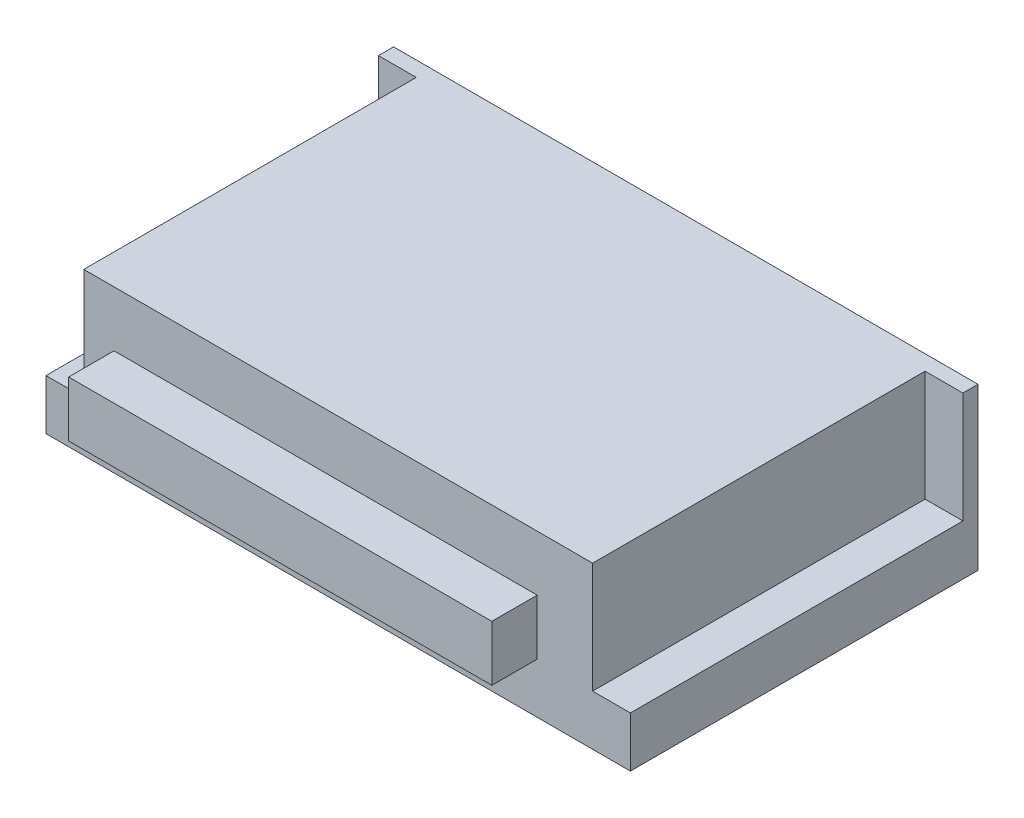
ISO-10303-21;
HEADER;
FILE_DESCRIPTION(('STEP AP214'),'2;1');
FILE_NAME('part.step','',(''),(''),'','','');
FILE_SCHEMA(('AUTOMOTIVE_DESIGN { 1 0 10303 214 1 1 1 1 }'));
ENDSEC;
DATA;
#1=APPLICATION_CONTEXT('core data for automotive mechanical design processes');
#2=APPLICATION_PROTOCOL_DEFINITION('international standard','automotive_design',2000,#1);
#3=PRODUCT_CONTEXT('',#1,'mechanical');
#4=PRODUCT('Part','Part','',(#3));
#5=PRODUCT_RELATED_PRODUCT_CATEGORY('part','',(#4));
#6=PRODUCT_DEFINITION_FORMATION('','',#4);
#7=PRODUCT_DEFINITION_CONTEXT('part definition',#1,'design');
#8=PRODUCT_DEFINITION('design','',#6,#7);
#9=PRODUCT_DEFINITION_SHAPE('','',#8);
#10=(LENGTH_UNIT() NAMED_UNIT(*) SI_UNIT(.MILLI.,.METRE.));
#11=(NAMED_UNIT(*) PLANE_ANGLE_UNIT() SI_UNIT($,.RADIAN.));
#12=(NAMED_UNIT(*) SI_UNIT($,.STERADIAN.) SOLID_ANGLE_UNIT());
#13=UNCERTAINTY_MEASURE_WITH_UNIT(LENGTH_MEASURE(1.E-05),#10,'distance_accuracy_value','');
#14=(GEOMETRIC_REPRESENTATION_CONTEXT(3) GLOBAL_UNCERTAINTY_ASSIGNED_CONTEXT((#13)) GLOBAL_UNIT_ASSIGNED_CONTEXT((#10,
#11,#12)) REPRESENTATION_CONTEXT('',''));
#15=CARTESIAN_POINT('',(0.,0.,0.));
#16=DIRECTION('',(0.,0.,1.));
#17=DIRECTION('',(1.,0.,0.));
#18=AXIS2_PLACEMENT_3D('',#15,#16,#17);
#19=CARTESIAN_POINT('',(0.,32.,0.));
#20=DIRECTION('',(0.,0.,-1.));
#21=DIRECTION('',(-1.,0.,0.));
#22=AXIS2_PLACEMENT_3D('',#19,#20,#21);
#23=PLANE('',#22);
#24=DIRECTION('',(1.,0.,0.));
#25=VECTOR('',#24,1.);
#26=CARTESIAN_POINT('',(0.,32.,0.));
#27=LINE('',#26,#25);
#28=CARTESIAN_POINT('',(7.5,32.,0.));
#29=VERTEX_POINT('',#28);
#30=CARTESIAN_POINT('',(108.5,32.,0.));
#31=VERTEX_POINT('',#30);
#32=EDGE_CURVE('E214',#29,#31,#27,.T.);
#33=ORIENTED_EDGE('',*,*,#32,.F.);
#34=DIRECTION('',(0.,1.,0.));
#35=VECTOR('',#34,1.);
#36=CARTESIAN_POINT('',(7.5,10.,0.));
#37=LINE('',#36,#35);
#38=CARTESIAN_POINT('',(7.5,10.,0.));
#39=VERTEX_POINT('',#38);
#40=EDGE_CURVE('E177',#39,#29,#37,.T.);
#41=ORIENTED_EDGE('',*,*,#40,.F.);
#42=DIRECTION('',(1.,0.,0.));
#43=VECTOR('',#42,1.);
#44=CARTESIAN_POINT('',(0.,10.,0.));
#45=LINE('',#44,#43);
#46=CARTESIAN_POINT('',(0.,10.,0.));
#47=VERTEX_POINT('',#46);
#48=EDGE_CURVE('E169',#47,#39,#45,.T.);
#49=ORIENTED_EDGE('',*,*,#48,.F.);
#50=DIRECTION('',(0.,-1.,0.));
#51=VECTOR('',#50,1.);
#52=CARTESIAN_POINT('',(0.,32.,0.));
#53=LINE('',#52,#51);
#54=CARTESIAN_POINT('',(0.,0.,0.));
#55=VERTEX_POINT('',#54);
#56=EDGE_CURVE('E11',#47,#55,#53,.T.);
#57=ORIENTED_EDGE('',*,*,#56,.T.);
#58=DIRECTION('',(1.,0.,0.));
#59=VECTOR('',#58,1.);
#60=CARTESIAN_POINT('',(0.,0.,0.));
#61=LINE('',#60,#59);
#62=CARTESIAN_POINT('',(116.,0.,0.));
#63=VERTEX_POINT('',#62);
#64=EDGE_CURVE('E224',#55,#63,#61,.T.);
#65=ORIENTED_EDGE('',*,*,#64,.T.);
#66=DIRECTION('',(0.,-1.,0.));
#67=VECTOR('',#66,1.);
#68=CARTESIAN_POINT('',(116.,32.,0.));
#69=LINE('',#68,#67);
#70=CARTESIAN_POINT('',(116.,10.,0.));
#71=VERTEX_POINT('',#70);
#72=EDGE_CURVE('E45',#71,#63,#69,.T.);
#73=ORIENTED_EDGE('',*,*,#72,.F.);
#74=DIRECTION('',(1.,0.,0.));
#75=VECTOR('',#74,1.);
#76=CARTESIAN_POINT('',(116.,10.,0.));
#77=LINE('',#76,#75);
#78=CARTESIAN_POINT('',(108.5,10.,0.));
#79=VERTEX_POINT('',#78);
#80=EDGE_CURVE('E197',#79,#71,#77,.T.);
#81=ORIENTED_EDGE('',*,*,#80,.F.);
#82=DIRECTION('',(0.,1.,0.));
#83=VECTOR('',#82,1.);
#84=CARTESIAN_POINT('',(108.5,10.,0.));
#85=LINE('',#84,#83);
#86=EDGE_CURVE('E204',#79,#31,#85,.T.);
#87=ORIENTED_EDGE('',*,*,#86,.T.);
#88=EDGE_LOOP('',(#33,#41,#49,#57,#65,#73,#81,#87));
#89=FACE_BOUND('',#88,.T.);
#90=DIRECTION('',(0.,-1.,0.));
#91=VECTOR('',#90,1.);
#92=CARTESIAN_POINT('',(13.5,10.,0.));
#93=LINE('',#92,#91);
#94=CARTESIAN_POINT('',(13.5,21.,0.));
#95=VERTEX_POINT('',#94);
#96=CARTESIAN_POINT('',(13.5,10.,0.));
#97=VERTEX_POINT('',#96);
#98=EDGE_CURVE('E157',#95,#97,#93,.T.);
#99=ORIENTED_EDGE('',*,*,#98,.F.);
#100=DIRECTION('',(-1.,0.,0.));
#101=VECTOR('',#100,1.);
#102=CARTESIAN_POINT('',(13.5,21.,0.));
#103=LINE('',#102,#101);
#104=CARTESIAN_POINT('',(97.5,21.,0.));
#105=VERTEX_POINT('',#104);
#106=EDGE_CURVE('E154',#105,#95,#103,.T.);
#107=ORIENTED_EDGE('',*,*,#106,.F.);
#108=DIRECTION('',(0.,1.,0.));
#109=VECTOR('',#108,1.);
#110=CARTESIAN_POINT('',(97.5,10.,0.));
#111=LINE('',#110,#109);
#112=CARTESIAN_POINT('',(97.5,10.,0.));
#113=VERTEX_POINT('',#112);
#114=EDGE_CURVE('E57',#113,#105,#111,.T.);
#115=ORIENTED_EDGE('',*,*,#114,.F.);
#116=DIRECTION('',(1.,0.,0.));
#117=VECTOR('',#116,1.);
#118=CARTESIAN_POINT('',(13.5,10.,0.));
#119=LINE('',#118,#117);
#120=EDGE_CURVE('E52',#97,#113,#119,.T.);
#121=ORIENTED_EDGE('',*,*,#120,.F.);
#122=EDGE_LOOP('',(#99,#107,#115,#121));
#123=FACE_BOUND('',#122,.T.);
#124=ADVANCED_FACE('F37',(#89,#123),#23,.F.);
#125=CARTESIAN_POINT('',(0.,32.,0.));
#126=DIRECTION('',(1.,0.,0.));
#127=DIRECTION('',(0.,0.,-1.));
#128=AXIS2_PLACEMENT_3D('',#125,#126,#127);
#129=PLANE('',#128);
#130=DIRECTION('',(0.,0.,1.));
#131=VECTOR('',#130,1.);
#132=CARTESIAN_POINT('',(0.,10.,0.));
#133=LINE('',#132,#131);
#134=CARTESIAN_POINT('',(0.,10.,-66.));
#135=VERTEX_POINT('',#134);
#136=EDGE_CURVE('E167',#135,#47,#133,.T.);
#137=ORIENTED_EDGE('',*,*,#136,.F.);
#138=DIRECTION('',(0.,1.,0.));
#139=VECTOR('',#138,1.);
#140=CARTESIAN_POINT('',(0.,10.,-66.));
#141=LINE('',#140,#139);
#142=CARTESIAN_POINT('',(0.,32.,-66.));
#143=VERTEX_POINT('',#142);
#144=EDGE_CURVE('E180',#135,#143,#141,.T.);
#145=ORIENTED_EDGE('',*,*,#144,.T.);
#146=DIRECTION('',(0.,0.,1.));
#147=VECTOR('',#146,1.);
#148=CARTESIAN_POINT('',(0.,32.,0.));
#149=LINE('',#148,#147);
#150=CARTESIAN_POINT('',(0.,32.,-69.));
#151=VERTEX_POINT('',#150);
#152=EDGE_CURVE('E211',#151,#143,#149,.T.);
#153=ORIENTED_EDGE('',*,*,#152,.F.);
#154=DIRECTION('',(0.,-1.,0.));
#155=VECTOR('',#154,1.);
#156=CARTESIAN_POINT('',(0.,32.,-69.));
#157=LINE('',#156,#155);
#158=CARTESIAN_POINT('',(0.,0.,-69.));
#159=VERTEX_POINT('',#158);
#160=EDGE_CURVE('E221',#151,#159,#157,.T.);
#161=ORIENTED_EDGE('',*,*,#160,.T.);
#162=DIRECTION('',(0.,0.,1.));
#163=VECTOR('',#162,1.);
#164=CARTESIAN_POINT('',(0.,0.,0.));
#165=LINE('',#164,#163);
#166=EDGE_CURVE('E207',#159,#55,#165,.T.);
#167=ORIENTED_EDGE('',*,*,#166,.T.);
#168=ORIENTED_EDGE('',*,*,#56,.F.);
#169=EDGE_LOOP('',(#137,#145,#153,#161,#167,#168));
#170=FACE_BOUND('',#169,.T.);
#171=ADVANCED_FACE('F39',(#170),#129,.F.);
#172=CARTESIAN_POINT('',(116.,32.,0.));
#173=DIRECTION('',(-1.,0.,0.));
#174=DIRECTION('',(0.,0.,1.));
#175=AXIS2_PLACEMENT_3D('',#172,#173,#174);
#176=PLANE('',#175);
#177=DIRECTION('',(0.,0.,-1.));
#178=VECTOR('',#177,1.);
#179=CARTESIAN_POINT('',(116.,32.,0.));
#180=LINE('',#179,#178);
#181=CARTESIAN_POINT('',(116.,32.,-66.));
#182=VERTEX_POINT('',#181);
#183=CARTESIAN_POINT('',(116.,32.,-69.));
#184=VERTEX_POINT('',#183);
#185=EDGE_CURVE('E217',#182,#184,#180,.T.);
#186=ORIENTED_EDGE('',*,*,#185,.F.);
#187=DIRECTION('',(0.,1.,0.));
#188=VECTOR('',#187,1.);
#189=CARTESIAN_POINT('',(116.,10.,-66.));
#190=LINE('',#189,#188);
#191=CARTESIAN_POINT('',(116.,10.,-66.));
#192=VERTEX_POINT('',#191);
#193=EDGE_CURVE('E199',#192,#182,#190,.T.);
#194=ORIENTED_EDGE('',*,*,#193,.F.);
#195=DIRECTION('',(0.,0.,-1.));
#196=VECTOR('',#195,1.);
#197=CARTESIAN_POINT('',(116.,10.,0.));
#198=LINE('',#197,#196);
#199=EDGE_CURVE('E187',#71,#192,#198,.T.);
#200=ORIENTED_EDGE('',*,*,#199,.F.);
#201=ORIENTED_EDGE('',*,*,#72,.T.);
#202=DIRECTION('',(0.,0.,-1.));
#203=VECTOR('',#202,1.);
#204=CARTESIAN_POINT('',(116.,0.,0.));
#205=LINE('',#204,#203);
#206=CARTESIAN_POINT('',(116.,0.,-69.));
#207=VERTEX_POINT('',#206);
#208=EDGE_CURVE('E227',#63,#207,#205,.T.);
#209=ORIENTED_EDGE('',*,*,#208,.T.);
#210=DIRECTION('',(0.,-1.,0.));
#211=VECTOR('',#210,1.);
#212=CARTESIAN_POINT('',(116.,32.,-69.));
#213=LINE('',#212,#211);
#214=EDGE_CURVE('E232',#184,#207,#213,.T.);
#215=ORIENTED_EDGE('',*,*,#214,.F.);
#216=EDGE_LOOP('',(#186,#194,#200,#201,#209,#215));
#217=FACE_BOUND('',#216,.T.);
#218=ADVANCED_FACE('F238',(#217),#176,.F.);
#219=CARTESIAN_POINT('',(0.,32.,-69.));
#220=DIRECTION('',(0.,0.,1.));
#221=DIRECTION('',(1.,0.,0.));
#222=AXIS2_PLACEMENT_3D('',#219,#220,#221);
#223=PLANE('',#222);
#224=DIRECTION('',(-1.,0.,0.));
#225=VECTOR('',#224,1.);
#226=CARTESIAN_POINT('',(0.,0.,-69.));
#227=LINE('',#226,#225);
#228=EDGE_CURVE('E215',#207,#159,#227,.T.);
#229=ORIENTED_EDGE('',*,*,#228,.T.);
#230=ORIENTED_EDGE('',*,*,#160,.F.);
#231=DIRECTION('',(-1.,0.,0.));
#232=VECTOR('',#231,1.);
#233=CARTESIAN_POINT('',(0.,32.,-69.));
#234=LINE('',#233,#232);
#235=EDGE_CURVE('E219',#184,#151,#234,.T.);
#236=ORIENTED_EDGE('',*,*,#235,.F.);
#237=ORIENTED_EDGE('',*,*,#214,.T.);
#238=EDGE_LOOP('',(#229,#230,#236,#237));
#239=FACE_BOUND('',#238,.T.);
#240=ADVANCED_FACE('F254',(#239),#223,.F.);
#241=CARTESIAN_POINT('',(0.,32.,0.));
#242=DIRECTION('',(0.,-1.,0.));
#243=DIRECTION('',(0.,0.,-1.));
#244=AXIS2_PLACEMENT_3D('',#241,#242,#243);
#245=PLANE('',#244);
#246=ORIENTED_EDGE('',*,*,#152,.T.);
#247=DIRECTION('',(-1.,0.,0.));
#248=VECTOR('',#247,1.);
#249=CARTESIAN_POINT('',(0.,32.,-66.));
#250=LINE('',#249,#248);
#251=CARTESIAN_POINT('',(7.5,32.,-66.));
#252=VERTEX_POINT('',#251);
#253=EDGE_CURVE('E161',#252,#143,#250,.T.);
#254=ORIENTED_EDGE('',*,*,#253,.F.);
#255=DIRECTION('',(0.,0.,-1.));
#256=VECTOR('',#255,1.);
#257=CARTESIAN_POINT('',(7.5,32.,0.));
#258=LINE('',#257,#256);
#259=EDGE_CURVE('E158',#29,#252,#258,.T.);
#260=ORIENTED_EDGE('',*,*,#259,.F.);
#261=ORIENTED_EDGE('',*,*,#32,.T.);
#262=DIRECTION('',(0.,0.,1.));
#263=VECTOR('',#262,1.);
#264=CARTESIAN_POINT('',(108.5,32.,0.));
#265=LINE('',#264,#263);
#266=CARTESIAN_POINT('',(108.5,32.,-66.));
#267=VERTEX_POINT('',#266);
#268=EDGE_CURVE('E191',#267,#31,#265,.T.);
#269=ORIENTED_EDGE('',*,*,#268,.F.);
#270=DIRECTION('',(-1.,0.,0.));
#271=VECTOR('',#270,1.);
#272=CARTESIAN_POINT('',(116.,32.,-66.));
#273=LINE('',#272,#271);
#274=EDGE_CURVE('E183',#182,#267,#273,.T.);
#275=ORIENTED_EDGE('',*,*,#274,.F.);
#276=ORIENTED_EDGE('',*,*,#185,.T.);
#277=ORIENTED_EDGE('',*,*,#235,.T.);
#278=EDGE_LOOP('',(#246,#254,#260,#261,#269,#275,#276,#277));
#279=FACE_BOUND('',#278,.T.);
#280=ADVANCED_FACE('F261',(#279),#245,.F.);
#281=CARTESIAN_POINT('',(0.,0.,0.));
#282=DIRECTION('',(0.,-1.,0.));
#283=DIRECTION('',(0.,0.,-1.));
#284=AXIS2_PLACEMENT_3D('',#281,#282,#283);
#285=PLANE('',#284);
#286=ORIENTED_EDGE('',*,*,#166,.F.);
#287=ORIENTED_EDGE('',*,*,#228,.F.);
#288=ORIENTED_EDGE('',*,*,#208,.F.);
#289=ORIENTED_EDGE('',*,*,#64,.F.);
#290=EDGE_LOOP('',(#286,#287,#288,#289));
#291=FACE_BOUND('',#290,.T.);
#292=ADVANCED_FACE('F251',(#291),#285,.T.);
#293=CARTESIAN_POINT('',(108.5,10.,0.));
#294=DIRECTION('',(-1.,0.,0.));
#295=DIRECTION('',(0.,0.,1.));
#296=AXIS2_PLACEMENT_3D('',#293,#294,#295);
#297=PLANE('',#296);
#298=ORIENTED_EDGE('',*,*,#268,.T.);
#299=ORIENTED_EDGE('',*,*,#86,.F.);
#300=DIRECTION('',(0.,0.,1.));
#301=VECTOR('',#300,1.);
#302=CARTESIAN_POINT('',(108.5,10.,0.));
#303=LINE('',#302,#301);
#304=CARTESIAN_POINT('',(108.5,10.,-66.));
#305=VERTEX_POINT('',#304);
#306=EDGE_CURVE('E194',#305,#79,#303,.T.);
#307=ORIENTED_EDGE('',*,*,#306,.F.);
#308=DIRECTION('',(0.,1.,0.));
#309=VECTOR('',#308,1.);
#310=CARTESIAN_POINT('',(108.5,10.,-66.));
#311=LINE('',#310,#309);
#312=EDGE_CURVE('E208',#305,#267,#311,.T.);
#313=ORIENTED_EDGE('',*,*,#312,.T.);
#314=EDGE_LOOP('',(#298,#299,#307,#313));
#315=FACE_BOUND('',#314,.T.);
#316=ADVANCED_FACE('F272',(#315),#297,.F.);
#317=CARTESIAN_POINT('',(116.,10.,-66.));
#318=DIRECTION('',(0.,0.,-1.));
#319=DIRECTION('',(-1.,0.,0.));
#320=AXIS2_PLACEMENT_3D('',#317,#318,#319);
#321=PLANE('',#320);
#322=ORIENTED_EDGE('',*,*,#274,.T.);
#323=ORIENTED_EDGE('',*,*,#312,.F.);
#324=DIRECTION('',(-1.,0.,0.));
#325=VECTOR('',#324,1.);
#326=CARTESIAN_POINT('',(116.,10.,-66.));
#327=LINE('',#326,#325);
#328=EDGE_CURVE('E190',#192,#305,#327,.T.);
#329=ORIENTED_EDGE('',*,*,#328,.F.);
#330=ORIENTED_EDGE('',*,*,#193,.T.);
#331=EDGE_LOOP('',(#322,#323,#329,#330));
#332=FACE_BOUND('',#331,.T.);
#333=ADVANCED_FACE('F266',(#332),#321,.F.);
#334=CARTESIAN_POINT('',(0.,10.,0.));
#335=DIRECTION('',(0.,1.,0.));
#336=DIRECTION('',(0.,0.,1.));
#337=AXIS2_PLACEMENT_3D('',#334,#335,#336);
#338=PLANE('',#337);
#339=ORIENTED_EDGE('',*,*,#199,.T.);
#340=ORIENTED_EDGE('',*,*,#328,.T.);
#341=ORIENTED_EDGE('',*,*,#306,.T.);
#342=ORIENTED_EDGE('',*,*,#80,.T.);
#343=EDGE_LOOP('',(#339,#340,#341,#342));
#344=FACE_BOUND('',#343,.T.);
#345=ADVANCED_FACE('F269',(#344),#338,.T.);
#346=CARTESIAN_POINT('',(0.,10.,-66.));
#347=DIRECTION('',(0.,0.,-1.));
#348=DIRECTION('',(-1.,0.,0.));
#349=AXIS2_PLACEMENT_3D('',#346,#347,#348);
#350=PLANE('',#349);
#351=ORIENTED_EDGE('',*,*,#253,.T.);
#352=ORIENTED_EDGE('',*,*,#144,.F.);
#353=DIRECTION('',(-1.,0.,0.));
#354=VECTOR('',#353,1.);
#355=CARTESIAN_POINT('',(0.,10.,-66.));
#356=LINE('',#355,#354);
#357=CARTESIAN_POINT('',(7.5,10.,-66.));
#358=VERTEX_POINT('',#357);
#359=EDGE_CURVE('E175',#358,#135,#356,.T.);
#360=ORIENTED_EDGE('',*,*,#359,.F.);
#361=DIRECTION('',(0.,1.,0.));
#362=VECTOR('',#361,1.);
#363=CARTESIAN_POINT('',(7.5,10.,-66.));
#364=LINE('',#363,#362);
#365=EDGE_CURVE('E184',#358,#252,#364,.T.);
#366=ORIENTED_EDGE('',*,*,#365,.T.);
#367=EDGE_LOOP('',(#351,#352,#360,#366));
#368=FACE_BOUND('',#367,.T.);
#369=ADVANCED_FACE('F279',(#368),#350,.F.);
#370=CARTESIAN_POINT('',(7.5,10.,0.));
#371=DIRECTION('',(1.,0.,0.));
#372=DIRECTION('',(0.,0.,-1.));
#373=AXIS2_PLACEMENT_3D('',#370,#371,#372);
#374=PLANE('',#373);
#375=ORIENTED_EDGE('',*,*,#259,.T.);
#376=ORIENTED_EDGE('',*,*,#365,.F.);
#377=DIRECTION('',(0.,0.,-1.));
#378=VECTOR('',#377,1.);
#379=CARTESIAN_POINT('',(7.5,10.,0.));
#380=LINE('',#379,#378);
#381=EDGE_CURVE('E172',#39,#358,#380,.T.);
#382=ORIENTED_EDGE('',*,*,#381,.F.);
#383=ORIENTED_EDGE('',*,*,#40,.T.);
#384=EDGE_LOOP('',(#375,#376,#382,#383));
#385=FACE_BOUND('',#384,.T.);
#386=ADVANCED_FACE('F274',(#385),#374,.F.);
#387=CARTESIAN_POINT('',(0.,10.,0.));
#388=DIRECTION('',(0.,-1.,0.));
#389=DIRECTION('',(0.,0.,-1.));
#390=AXIS2_PLACEMENT_3D('',#387,#388,#389);
#391=PLANE('',#390);
#392=ORIENTED_EDGE('',*,*,#136,.T.);
#393=ORIENTED_EDGE('',*,*,#48,.T.);
#394=ORIENTED_EDGE('',*,*,#381,.T.);
#395=ORIENTED_EDGE('',*,*,#359,.T.);
#396=EDGE_LOOP('',(#392,#393,#394,#395));
#397=FACE_BOUND('',#396,.T.);
#398=ADVANCED_FACE('F276',(#397),#391,.F.);
#399=CARTESIAN_POINT('',(13.5,10.,9.));
#400=DIRECTION('',(1.,0.,0.));
#401=DIRECTION('',(0.,0.,-1.));
#402=AXIS2_PLACEMENT_3D('',#399,#400,#401);
#403=PLANE('',#402);
#404=ORIENTED_EDGE('',*,*,#98,.T.);
#405=DIRECTION('',(0.,0.,-1.));
#406=VECTOR('',#405,1.);
#407=CARTESIAN_POINT('',(13.5,10.,9.));
#408=LINE('',#407,#406);
#409=CARTESIAN_POINT('',(13.5,10.,9.));
#410=VERTEX_POINT('',#409);
#411=EDGE_CURVE('E138',#410,#97,#408,.T.);
#412=ORIENTED_EDGE('',*,*,#411,.F.);
#413=DIRECTION('',(0.,-1.,0.));
#414=VECTOR('',#413,1.);
#415=CARTESIAN_POINT('',(13.5,10.,9.));
#416=LINE('',#415,#414);
#417=CARTESIAN_POINT('',(13.5,21.,9.));
#418=VERTEX_POINT('',#417);
#419=EDGE_CURVE('E145',#418,#410,#416,.T.);
#420=ORIENTED_EDGE('',*,*,#419,.F.);
#421=DIRECTION('',(0.,0.,-1.));
#422=VECTOR('',#421,1.);
#423=CARTESIAN_POINT('',(13.5,21.,9.));
#424=LINE('',#423,#422);
#425=EDGE_CURVE('E454',#418,#95,#424,.T.);
#426=ORIENTED_EDGE('',*,*,#425,.T.);
#427=EDGE_LOOP('',(#404,#412,#420,#426));
#428=FACE_BOUND('',#427,.T.);
#429=ADVANCED_FACE('F156',(#428),#403,.F.);
#430=CARTESIAN_POINT('',(13.5,10.,9.));
#431=DIRECTION('',(0.,1.,0.));
#432=DIRECTION('',(0.,0.,1.));
#433=AXIS2_PLACEMENT_3D('',#430,#431,#432);
#434=PLANE('',#433);
#435=ORIENTED_EDGE('',*,*,#120,.T.);
#436=DIRECTION('',(0.,0.,-1.));
#437=VECTOR('',#436,1.);
#438=CARTESIAN_POINT('',(97.5,10.,9.));
#439=LINE('',#438,#437);
#440=CARTESIAN_POINT('',(97.5,10.,9.));
#441=VERTEX_POINT('',#440);
#442=EDGE_CURVE('E141',#441,#113,#439,.T.);
#443=ORIENTED_EDGE('',*,*,#442,.F.);
#444=DIRECTION('',(1.,0.,0.));
#445=VECTOR('',#444,1.);
#446=CARTESIAN_POINT('',(13.5,10.,9.));
#447=LINE('',#446,#445);
#448=EDGE_CURVE('E134',#410,#441,#447,.T.);
#449=ORIENTED_EDGE('',*,*,#448,.F.);
#450=ORIENTED_EDGE('',*,*,#411,.T.);
#451=EDGE_LOOP('',(#435,#443,#449,#450));
#452=FACE_BOUND('',#451,.T.);
#453=ADVANCED_FACE('F136',(#452),#434,.F.);
#454=CARTESIAN_POINT('',(97.5,10.,9.));
#455=DIRECTION('',(-1.,0.,0.));
#456=DIRECTION('',(0.,0.,1.));
#457=AXIS2_PLACEMENT_3D('',#454,#455,#456);
#458=PLANE('',#457);
#459=ORIENTED_EDGE('',*,*,#114,.T.);
#460=DIRECTION('',(0.,0.,-1.));
#461=VECTOR('',#460,1.);
#462=CARTESIAN_POINT('',(97.5,21.,9.));
#463=LINE('',#462,#461);
#464=CARTESIAN_POINT('',(97.5,21.,9.));
#465=VERTEX_POINT('',#464);
#466=EDGE_CURVE('E163',#465,#105,#463,.T.);
#467=ORIENTED_EDGE('',*,*,#466,.F.);
#468=DIRECTION('',(0.,1.,0.));
#469=VECTOR('',#468,1.);
#470=CARTESIAN_POINT('',(97.5,10.,9.));
#471=LINE('',#470,#469);
#472=EDGE_CURVE('E144',#441,#465,#471,.T.);
#473=ORIENTED_EDGE('',*,*,#472,.F.);
#474=ORIENTED_EDGE('',*,*,#442,.T.);
#475=EDGE_LOOP('',(#459,#467,#473,#474));
#476=FACE_BOUND('',#475,.T.);
#477=ADVANCED_FACE('F361',(#476),#458,.F.);
#478=CARTESIAN_POINT('',(13.5,21.,9.));
#479=DIRECTION('',(0.,-1.,0.));
#480=DIRECTION('',(0.,0.,-1.));
#481=AXIS2_PLACEMENT_3D('',#478,#479,#480);
#482=PLANE('',#481);
#483=ORIENTED_EDGE('',*,*,#106,.T.);
#484=ORIENTED_EDGE('',*,*,#425,.F.);
#485=DIRECTION('',(-1.,0.,0.));
#486=VECTOR('',#485,1.);
#487=CARTESIAN_POINT('',(13.5,21.,9.));
#488=LINE('',#487,#486);
#489=EDGE_CURVE('E150',#465,#418,#488,.T.);
#490=ORIENTED_EDGE('',*,*,#489,.F.);
#491=ORIENTED_EDGE('',*,*,#466,.T.);
#492=EDGE_LOOP('',(#483,#484,#490,#491));
#493=FACE_BOUND('',#492,.T.);
#494=ADVANCED_FACE('F342',(#493),#482,.F.);
#495=CARTESIAN_POINT('',(0.,0.,9.));
#496=DIRECTION('',(0.,0.,-1.));
#497=DIRECTION('',(-1.,0.,0.));
#498=AXIS2_PLACEMENT_3D('',#495,#496,#497);
#499=PLANE('',#498);
#500=ORIENTED_EDGE('',*,*,#419,.T.);
#501=ORIENTED_EDGE('',*,*,#448,.T.);
#502=ORIENTED_EDGE('',*,*,#472,.T.);
#503=ORIENTED_EDGE('',*,*,#489,.T.);
#504=EDGE_LOOP('',(#500,#501,#502,#503));
#505=FACE_BOUND('',#504,.T.);
#506=ADVANCED_FACE('F148',(#505),#499,.F.);
#507=CLOSED_SHELL('',(#124,#171,#218,#240,#280,#292,#316,#333,#345,#369,#386,#398,#429,#453,
#477,#494,#506));
#508=MANIFOLD_SOLID_BREP('B2',#507);
#509=ADVANCED_BREP_SHAPE_REPRESENTATION('',(#18,#508),#14);
#510=SHAPE_DEFINITION_REPRESENTATION(#9,#509);
ENDSEC;
END-ISO-10303-21;
